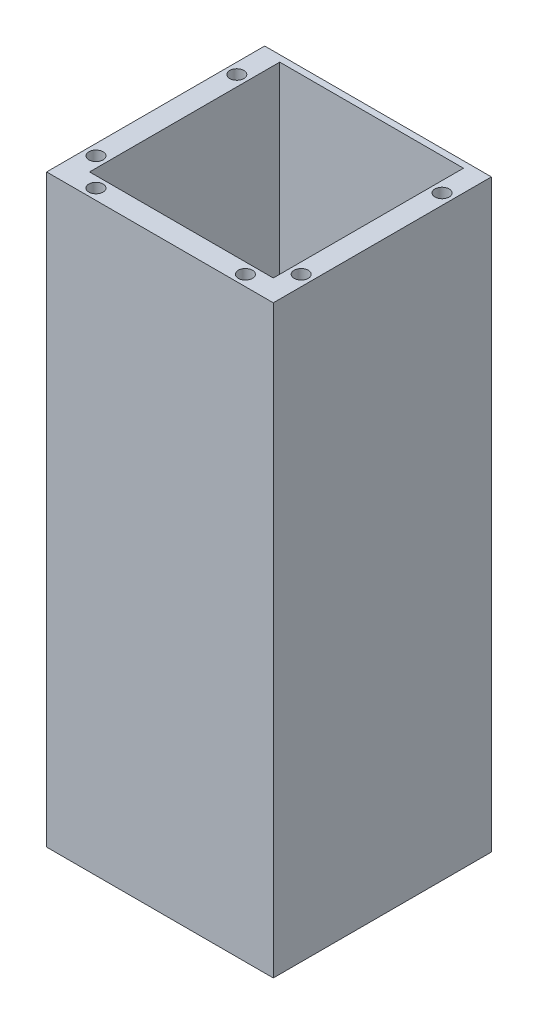
ISO-10303-21;
HEADER;
FILE_DESCRIPTION(('STEP AP214'),'2;1');
FILE_NAME('part.step','',(''),(''),'','','');
FILE_SCHEMA(('AUTOMOTIVE_DESIGN { 1 0 10303 214 1 1 1 1 }'));
ENDSEC;
DATA;
#1=APPLICATION_CONTEXT('core data for automotive mechanical design processes');
#2=APPLICATION_PROTOCOL_DEFINITION('international standard','automotive_design',2000,#1);
#3=PRODUCT_CONTEXT('',#1,'mechanical');
#4=PRODUCT('Part','Part','',(#3));
#5=PRODUCT_RELATED_PRODUCT_CATEGORY('part','',(#4));
#6=PRODUCT_DEFINITION_FORMATION('','',#4);
#7=PRODUCT_DEFINITION_CONTEXT('part definition',#1,'design');
#8=PRODUCT_DEFINITION('design','',#6,#7);
#9=PRODUCT_DEFINITION_SHAPE('','',#8);
#10=(LENGTH_UNIT() NAMED_UNIT(*) SI_UNIT(.MILLI.,.METRE.));
#11=(NAMED_UNIT(*) PLANE_ANGLE_UNIT() SI_UNIT($,.RADIAN.));
#12=(NAMED_UNIT(*) SI_UNIT($,.STERADIAN.) SOLID_ANGLE_UNIT());
#13=UNCERTAINTY_MEASURE_WITH_UNIT(LENGTH_MEASURE(1.E-05),#10,'distance_accuracy_value','');
#14=(GEOMETRIC_REPRESENTATION_CONTEXT(3) GLOBAL_UNCERTAINTY_ASSIGNED_CONTEXT((#13)) GLOBAL_UNIT_ASSIGNED_CONTEXT((#10,
#11,#12)) REPRESENTATION_CONTEXT('',''));
#15=CARTESIAN_POINT('',(0.,0.,0.));
#16=DIRECTION('',(0.,0.,1.));
#17=DIRECTION('',(1.,0.,0.));
#18=AXIS2_PLACEMENT_3D('',#15,#16,#17);
#19=CARTESIAN_POINT('',(-57.9891737439479,54.9791860465116,101.6));
#20=DIRECTION('',(1.,0.,0.));
#21=DIRECTION('',(0.,1.,0.));
#22=AXIS2_PLACEMENT_3D('',#19,#20,#21);
#23=PLANE('',#22);
#24=DIRECTION('',(0.,-1.,0.));
#25=VECTOR('',#24,1.);
#26=CARTESIAN_POINT('',(-57.9891737439479,54.9791860465116,0.));
#27=LINE('',#26,#25);
#28=CARTESIAN_POINT('',(-57.9891737439479,54.9791860465116,0.));
#29=VERTEX_POINT('',#28);
#30=CARTESIAN_POINT('',(-57.9891737439479,-217.420813953488,0.));
#31=VERTEX_POINT('',#30);
#32=EDGE_CURVE('E234',#29,#31,#27,.T.);
#33=ORIENTED_EDGE('',*,*,#32,.T.);
#34=DIRECTION('',(0.,0.,-1.));
#35=VECTOR('',#34,1.);
#36=CARTESIAN_POINT('',(-57.9891737439479,-217.420813953488,101.6));
#37=LINE('',#36,#35);
#38=CARTESIAN_POINT('',(-57.9891737439479,-217.420813953488,101.6));
#39=VERTEX_POINT('',#38);
#40=EDGE_CURVE('E40',#39,#31,#37,.T.);
#41=ORIENTED_EDGE('',*,*,#40,.F.);
#42=DIRECTION('',(0.,-1.,0.));
#43=VECTOR('',#42,1.);
#44=CARTESIAN_POINT('',(-57.9891737439479,54.9791860465116,101.6));
#45=LINE('',#44,#43);
#46=CARTESIAN_POINT('',(-57.9891737439479,54.9791860465116,101.6));
#47=VERTEX_POINT('',#46);
#48=EDGE_CURVE('E240',#47,#39,#45,.T.);
#49=ORIENTED_EDGE('',*,*,#48,.F.);
#50=DIRECTION('',(0.,0.,-1.));
#51=VECTOR('',#50,1.);
#52=CARTESIAN_POINT('',(-57.9891737439479,54.9791860465116,101.6));
#53=LINE('',#52,#51);
#54=EDGE_CURVE('E250',#47,#29,#53,.T.);
#55=ORIENTED_EDGE('',*,*,#54,.T.);
#56=EDGE_LOOP('',(#33,#41,#49,#55));
#57=FACE_BOUND('',#56,.T.);
#58=ADVANCED_FACE('F33',(#57),#23,.F.);
#59=CARTESIAN_POINT('',(-57.9891737439479,-217.420813953488,101.6));
#60=DIRECTION('',(0.,1.,0.));
#61=DIRECTION('',(0.,0.,1.));
#62=AXIS2_PLACEMENT_3D('',#59,#60,#61);
#63=PLANE('',#62);
#64=DIRECTION('',(1.,0.,0.));
#65=VECTOR('',#64,1.);
#66=CARTESIAN_POINT('',(-47.9891737439479,-217.420813953488,71.6));
#67=LINE('',#66,#65);
#68=CARTESIAN_POINT('',(-47.9891737439479,-217.420813953488,71.6));
#69=VERTEX_POINT('',#68);
#70=CARTESIAN_POINT('',(37.6108262560521,-217.420813953488,71.6));
#71=VERTEX_POINT('',#70);
#72=EDGE_CURVE('E203',#69,#71,#67,.T.);
#73=ORIENTED_EDGE('',*,*,#72,.F.);
#74=DIRECTION('',(0.,0.,-1.));
#75=VECTOR('',#74,1.);
#76=CARTESIAN_POINT('',(-47.9891737439479,-217.420813953488,91.6));
#77=LINE('',#76,#75);
#78=CARTESIAN_POINT('',(-47.9891737439479,-217.420813953488,91.6));
#79=VERTEX_POINT('',#78);
#80=EDGE_CURVE('E55',#79,#69,#77,.T.);
#81=ORIENTED_EDGE('',*,*,#80,.F.);
#82=DIRECTION('',(-1.,0.,0.));
#83=VECTOR('',#82,1.);
#84=CARTESIAN_POINT('',(-47.9891737439479,-217.420813953488,91.6));
#85=LINE('',#84,#83);
#86=CARTESIAN_POINT('',(37.6108262560521,-217.420813953488,91.6));
#87=VERTEX_POINT('',#86);
#88=EDGE_CURVE('E209',#87,#79,#85,.T.);
#89=ORIENTED_EDGE('',*,*,#88,.F.);
#90=DIRECTION('',(0.,0.,1.));
#91=VECTOR('',#90,1.);
#92=CARTESIAN_POINT('',(37.6108262560521,-217.420813953488,91.6));
#93=LINE('',#92,#91);
#94=EDGE_CURVE('E206',#71,#87,#93,.T.);
#95=ORIENTED_EDGE('',*,*,#94,.F.);
#96=EDGE_LOOP('',(#73,#81,#89,#95));
#97=FACE_BOUND('',#96,.T.);
#98=DIRECTION('',(1.,0.,0.));
#99=VECTOR('',#98,1.);
#100=CARTESIAN_POINT('',(-57.9891737439479,-217.420813953488,0.));
#101=LINE('',#100,#99);
#102=CARTESIAN_POINT('',(47.6108262560521,-217.420813953488,0.));
#103=VERTEX_POINT('',#102);
#104=EDGE_CURVE('E253',#31,#103,#101,.T.);
#105=ORIENTED_EDGE('',*,*,#104,.T.);
#106=DIRECTION('',(0.,0.,-1.));
#107=VECTOR('',#106,1.);
#108=CARTESIAN_POINT('',(47.6108262560521,-217.420813953488,101.6));
#109=LINE('',#108,#107);
#110=CARTESIAN_POINT('',(47.6108262560521,-217.420813953488,101.6));
#111=VERTEX_POINT('',#110);
#112=EDGE_CURVE('E263',#111,#103,#109,.T.);
#113=ORIENTED_EDGE('',*,*,#112,.F.);
#114=DIRECTION('',(1.,0.,0.));
#115=VECTOR('',#114,1.);
#116=CARTESIAN_POINT('',(-57.9891737439479,-217.420813953488,101.6));
#117=LINE('',#116,#115);
#118=EDGE_CURVE('E243',#39,#111,#117,.T.);
#119=ORIENTED_EDGE('',*,*,#118,.F.);
#120=ORIENTED_EDGE('',*,*,#40,.T.);
#121=EDGE_LOOP('',(#105,#113,#119,#120));
#122=FACE_BOUND('',#121,.T.);
#123=ADVANCED_FACE('F268',(#97,#122),#63,.F.);
#124=CARTESIAN_POINT('',(47.6108262560521,54.9791860465116,101.6));
#125=DIRECTION('',(-1.,0.,0.));
#126=DIRECTION('',(0.,-1.,0.));
#127=AXIS2_PLACEMENT_3D('',#124,#125,#126);
#128=PLANE('',#127);
#129=DIRECTION('',(0.,1.,0.));
#130=VECTOR('',#129,1.);
#131=CARTESIAN_POINT('',(47.6108262560521,54.9791860465116,0.));
#132=LINE('',#131,#130);
#133=CARTESIAN_POINT('',(47.6108262560521,54.9791860465116,0.));
#134=VERTEX_POINT('',#133);
#135=EDGE_CURVE('E255',#103,#134,#132,.T.);
#136=ORIENTED_EDGE('',*,*,#135,.T.);
#137=DIRECTION('',(0.,0.,-1.));
#138=VECTOR('',#137,1.);
#139=CARTESIAN_POINT('',(47.6108262560521,54.9791860465116,101.6));
#140=LINE('',#139,#138);
#141=CARTESIAN_POINT('',(47.6108262560521,54.9791860465116,101.6));
#142=VERTEX_POINT('',#141);
#143=EDGE_CURVE('E260',#142,#134,#140,.T.);
#144=ORIENTED_EDGE('',*,*,#143,.F.);
#145=DIRECTION('',(0.,1.,0.));
#146=VECTOR('',#145,1.);
#147=CARTESIAN_POINT('',(47.6108262560521,54.9791860465116,101.6));
#148=LINE('',#147,#146);
#149=EDGE_CURVE('E246',#111,#142,#148,.T.);
#150=ORIENTED_EDGE('',*,*,#149,.F.);
#151=ORIENTED_EDGE('',*,*,#112,.T.);
#152=EDGE_LOOP('',(#136,#144,#150,#151));
#153=FACE_BOUND('',#152,.T.);
#154=ADVANCED_FACE('F280',(#153),#128,.F.);
#155=CARTESIAN_POINT('',(-57.9891737439479,54.9791860465116,101.6));
#156=DIRECTION('',(0.,-1.,0.));
#157=DIRECTION('',(0.,0.,-1.));
#158=AXIS2_PLACEMENT_3D('',#155,#156,#157);
#159=PLANE('',#158);
#160=CARTESIAN_POINT('',(-52.9891737439479,54.9791860465116,18.));
#161=DIRECTION('',(0.,1.,0.));
#162=DIRECTION('',(0.,0.,1.));
#163=AXIS2_PLACEMENT_3D('',#160,#161,#162);
#164=CIRCLE('',#163,3.3);
#165=CARTESIAN_POINT('',(-52.9891737439479,54.9791860465116,21.3));
#166=VERTEX_POINT('',#165);
#167=EDGE_CURVE('E151',#166,#166,#164,.T.);
#168=ORIENTED_EDGE('',*,*,#167,.F.);
#169=EDGE_LOOP('',(#168));
#170=FACE_BOUND('',#169,.T.);
#171=CARTESIAN_POINT('',(-52.9891737439479,54.9791860465116,83.6));
#172=DIRECTION('',(0.,1.,0.));
#173=DIRECTION('',(0.,0.,1.));
#174=AXIS2_PLACEMENT_3D('',#171,#172,#173);
#175=CIRCLE('',#174,3.3);
#176=CARTESIAN_POINT('',(-52.9891737439479,54.9791860465116,86.9));
#177=VERTEX_POINT('',#176);
#178=EDGE_CURVE('E150',#177,#177,#175,.T.);
#179=ORIENTED_EDGE('',*,*,#178,.F.);
#180=EDGE_LOOP('',(#179));
#181=FACE_BOUND('',#180,.T.);
#182=CARTESIAN_POINT('',(42.6108262560521,54.9791860465116,18.));
#183=DIRECTION('',(0.,1.,0.));
#184=DIRECTION('',(0.,0.,1.));
#185=AXIS2_PLACEMENT_3D('',#182,#183,#184);
#186=CIRCLE('',#185,3.3);
#187=CARTESIAN_POINT('',(42.6108262560521,54.9791860465116,21.3));
#188=VERTEX_POINT('',#187);
#189=EDGE_CURVE('E161',#188,#188,#186,.T.);
#190=ORIENTED_EDGE('',*,*,#189,.F.);
#191=EDGE_LOOP('',(#190));
#192=FACE_BOUND('',#191,.T.);
#193=CARTESIAN_POINT('',(42.6108262560521,54.9791860465116,83.6));
#194=DIRECTION('',(0.,1.,0.));
#195=DIRECTION('',(0.,0.,1.));
#196=AXIS2_PLACEMENT_3D('',#193,#194,#195);
#197=CIRCLE('',#196,3.3);
#198=CARTESIAN_POINT('',(42.6108262560521,54.9791860465116,86.9));
#199=VERTEX_POINT('',#198);
#200=EDGE_CURVE('E167',#199,#199,#197,.T.);
#201=ORIENTED_EDGE('',*,*,#200,.F.);
#202=EDGE_LOOP('',(#201));
#203=FACE_BOUND('',#202,.T.);
#204=CARTESIAN_POINT('',(-39.9891737439479,54.9791860465116,96.6));
#205=DIRECTION('',(0.,1.,0.));
#206=DIRECTION('',(0.,0.,1.));
#207=AXIS2_PLACEMENT_3D('',#204,#205,#206);
#208=CIRCLE('',#207,3.3);
#209=CARTESIAN_POINT('',(-39.9891737439479,54.9791860465116,99.9));
#210=VERTEX_POINT('',#209);
#211=EDGE_CURVE('E173',#210,#210,#208,.T.);
#212=ORIENTED_EDGE('',*,*,#211,.F.);
#213=EDGE_LOOP('',(#212));
#214=FACE_BOUND('',#213,.T.);
#215=CARTESIAN_POINT('',(29.6108262560521,54.9791860465116,96.6));
#216=DIRECTION('',(0.,1.,0.));
#217=DIRECTION('',(0.,0.,1.));
#218=AXIS2_PLACEMENT_3D('',#215,#216,#217);
#219=CIRCLE('',#218,3.3);
#220=CARTESIAN_POINT('',(29.6108262560521,54.9791860465116,99.9));
#221=VERTEX_POINT('',#220);
#222=EDGE_CURVE('E179',#221,#221,#219,.T.);
#223=ORIENTED_EDGE('',*,*,#222,.F.);
#224=EDGE_LOOP('',(#223));
#225=FACE_BOUND('',#224,.T.);
#226=DIRECTION('',(1.,0.,0.));
#227=VECTOR('',#226,1.);
#228=CARTESIAN_POINT('',(-47.9891737439479,54.9791860465116,91.6));
#229=LINE('',#228,#227);
#230=CARTESIAN_POINT('',(-47.9891737439479,54.9791860465116,91.6));
#231=VERTEX_POINT('',#230);
#232=CARTESIAN_POINT('',(37.6108262560521,54.9791860465116,91.6));
#233=VERTEX_POINT('',#232);
#234=EDGE_CURVE('E224',#231,#233,#229,.T.);
#235=ORIENTED_EDGE('',*,*,#234,.F.);
#236=DIRECTION('',(0.,0.,1.));
#237=VECTOR('',#236,1.);
#238=CARTESIAN_POINT('',(-47.9891737439479,54.9791860465116,3.));
#239=LINE('',#238,#237);
#240=CARTESIAN_POINT('',(-47.9891737439479,54.9791860465116,3.));
#241=VERTEX_POINT('',#240);
#242=EDGE_CURVE('E215',#241,#231,#239,.T.);
#243=ORIENTED_EDGE('',*,*,#242,.F.);
#244=DIRECTION('',(-1.,0.,0.));
#245=VECTOR('',#244,1.);
#246=CARTESIAN_POINT('',(-47.9891737439479,54.9791860465116,3.));
#247=LINE('',#246,#245);
#248=CARTESIAN_POINT('',(37.6108262560521,54.9791860465116,3.));
#249=VERTEX_POINT('',#248);
#250=EDGE_CURVE('E219',#249,#241,#247,.T.);
#251=ORIENTED_EDGE('',*,*,#250,.F.);
#252=DIRECTION('',(0.,0.,-1.));
#253=VECTOR('',#252,1.);
#254=CARTESIAN_POINT('',(37.6108262560521,54.9791860465116,3.));
#255=LINE('',#254,#253);
#256=EDGE_CURVE('E227',#233,#249,#255,.T.);
#257=ORIENTED_EDGE('',*,*,#256,.F.);
#258=EDGE_LOOP('',(#235,#243,#251,#257));
#259=FACE_BOUND('',#258,.T.);
#260=DIRECTION('',(-1.,0.,0.));
#261=VECTOR('',#260,1.);
#262=CARTESIAN_POINT('',(-57.9891737439479,54.9791860465116,0.));
#263=LINE('',#262,#261);
#264=EDGE_CURVE('E244',#134,#29,#263,.T.);
#265=ORIENTED_EDGE('',*,*,#264,.T.);
#266=ORIENTED_EDGE('',*,*,#54,.F.);
#267=DIRECTION('',(-1.,0.,0.));
#268=VECTOR('',#267,1.);
#269=CARTESIAN_POINT('',(-57.9891737439479,54.9791860465116,101.6));
#270=LINE('',#269,#268);
#271=EDGE_CURVE('E248',#142,#47,#270,.T.);
#272=ORIENTED_EDGE('',*,*,#271,.F.);
#273=ORIENTED_EDGE('',*,*,#143,.T.);
#274=EDGE_LOOP('',(#265,#266,#272,#273));
#275=FACE_BOUND('',#274,.T.);
#276=ADVANCED_FACE('F284',(#170,#181,#192,#203,#214,#225,#259,#275),#159,.F.);
#277=CARTESIAN_POINT('',(0.,0.,101.6));
#278=DIRECTION('',(0.,0.,1.));
#279=DIRECTION('',(1.,0.,0.));
#280=AXIS2_PLACEMENT_3D('',#277,#278,#279);
#281=PLANE('',#280);
#282=ORIENTED_EDGE('',*,*,#48,.T.);
#283=ORIENTED_EDGE('',*,*,#118,.T.);
#284=ORIENTED_EDGE('',*,*,#149,.T.);
#285=ORIENTED_EDGE('',*,*,#271,.T.);
#286=EDGE_LOOP('',(#282,#283,#284,#285));
#287=FACE_BOUND('',#286,.T.);
#288=ADVANCED_FACE('F286',(#287),#281,.T.);
#289=CARTESIAN_POINT('',(0.,0.,0.));
#290=DIRECTION('',(0.,0.,1.));
#291=DIRECTION('',(1.,0.,0.));
#292=AXIS2_PLACEMENT_3D('',#289,#290,#291);
#293=PLANE('',#292);
#294=DIRECTION('',(-1.,0.,0.));
#295=VECTOR('',#294,1.);
#296=CARTESIAN_POINT('',(37.6108262560521,-207.420813953488,0.));
#297=LINE('',#296,#295);
#298=CARTESIAN_POINT('',(37.6108262560521,-207.420813953488,0.));
#299=VERTEX_POINT('',#298);
#300=CARTESIAN_POINT('',(-47.9891737439479,-207.420813953488,0.));
#301=VERTEX_POINT('',#300);
#302=EDGE_CURVE('E187',#299,#301,#297,.T.);
#303=ORIENTED_EDGE('',*,*,#302,.F.);
#304=DIRECTION('',(0.,-1.,0.));
#305=VECTOR('',#304,1.);
#306=CARTESIAN_POINT('',(37.6108262560521,-141.820813953488,0.));
#307=LINE('',#306,#305);
#308=CARTESIAN_POINT('',(37.6108262560521,-141.820813953488,0.));
#309=VERTEX_POINT('',#308);
#310=EDGE_CURVE('E185',#309,#299,#307,.T.);
#311=ORIENTED_EDGE('',*,*,#310,.F.);
#312=DIRECTION('',(1.,0.,0.));
#313=VECTOR('',#312,1.);
#314=CARTESIAN_POINT('',(37.6108262560521,-141.820813953488,0.));
#315=LINE('',#314,#313);
#316=CARTESIAN_POINT('',(-47.9891737439479,-141.820813953488,0.));
#317=VERTEX_POINT('',#316);
#318=EDGE_CURVE('E192',#317,#309,#315,.T.);
#319=ORIENTED_EDGE('',*,*,#318,.F.);
#320=DIRECTION('',(0.,1.,0.));
#321=VECTOR('',#320,1.);
#322=CARTESIAN_POINT('',(-47.9891737439479,-141.820813953488,0.));
#323=LINE('',#322,#321);
#324=EDGE_CURVE('E189',#301,#317,#323,.T.);
#325=ORIENTED_EDGE('',*,*,#324,.F.);
#326=EDGE_LOOP('',(#303,#311,#319,#325));
#327=FACE_BOUND('',#326,.T.);
#328=ORIENTED_EDGE('',*,*,#32,.F.);
#329=ORIENTED_EDGE('',*,*,#264,.F.);
#330=ORIENTED_EDGE('',*,*,#135,.F.);
#331=ORIENTED_EDGE('',*,*,#104,.F.);
#332=EDGE_LOOP('',(#328,#329,#330,#331));
#333=FACE_BOUND('',#332,.T.);
#334=ADVANCED_FACE('F276',(#327,#333),#293,.F.);
#335=CARTESIAN_POINT('',(-47.9891737439479,-207.420813953488,3.));
#336=DIRECTION('',(-1.,0.,0.));
#337=DIRECTION('',(0.,0.,1.));
#338=AXIS2_PLACEMENT_3D('',#335,#336,#337);
#339=PLANE('',#338);
#340=DIRECTION('',(0.,0.,-1.));
#341=VECTOR('',#340,1.);
#342=CARTESIAN_POINT('',(-47.9891737439479,-141.820813953488,30.));
#343=LINE('',#342,#341);
#344=CARTESIAN_POINT('',(-47.9891737439479,-141.820813953488,3.));
#345=VERTEX_POINT('',#344);
#346=EDGE_CURVE('E195',#345,#317,#343,.T.);
#347=ORIENTED_EDGE('',*,*,#346,.F.);
#348=DIRECTION('',(0.,1.,0.));
#349=VECTOR('',#348,1.);
#350=CARTESIAN_POINT('',(-47.9891737439479,-207.420813953488,3.));
#351=LINE('',#350,#349);
#352=EDGE_CURVE('E232',#345,#241,#351,.T.);
#353=ORIENTED_EDGE('',*,*,#352,.T.);
#354=ORIENTED_EDGE('',*,*,#242,.T.);
#355=DIRECTION('',(0.,1.,0.));
#356=VECTOR('',#355,1.);
#357=CARTESIAN_POINT('',(-47.9891737439479,-207.420813953488,91.6));
#358=LINE('',#357,#356);
#359=EDGE_CURVE('E221',#79,#231,#358,.T.);
#360=ORIENTED_EDGE('',*,*,#359,.F.);
#361=ORIENTED_EDGE('',*,*,#80,.T.);
#362=DIRECTION('',(0.,-1.,0.));
#363=VECTOR('',#362,1.);
#364=CARTESIAN_POINT('',(-47.9891737439479,-187.420813953488,71.6));
#365=LINE('',#364,#363);
#366=CARTESIAN_POINT('',(-47.9891737439479,-207.420813953488,71.6));
#367=VERTEX_POINT('',#366);
#368=EDGE_CURVE('E212',#367,#69,#365,.T.);
#369=ORIENTED_EDGE('',*,*,#368,.F.);
#370=DIRECTION('',(0.,0.,1.));
#371=VECTOR('',#370,1.);
#372=CARTESIAN_POINT('',(-47.9891737439479,-207.420813953488,3.));
#373=LINE('',#372,#371);
#374=EDGE_CURVE('E217',#301,#367,#373,.T.);
#375=ORIENTED_EDGE('',*,*,#374,.F.);
#376=ORIENTED_EDGE('',*,*,#324,.T.);
#377=EDGE_LOOP('',(#347,#353,#354,#360,#361,#369,#375,#376));
#378=FACE_BOUND('',#377,.T.);
#379=ADVANCED_FACE('F293',(#378),#339,.F.);
#380=CARTESIAN_POINT('',(-47.9891737439479,-207.420813953488,3.));
#381=DIRECTION('',(0.,0.,-1.));
#382=DIRECTION('',(-1.,0.,0.));
#383=AXIS2_PLACEMENT_3D('',#380,#381,#382);
#384=PLANE('',#383);
#385=ORIENTED_EDGE('',*,*,#352,.F.);
#386=DIRECTION('',(1.,0.,0.));
#387=VECTOR('',#386,1.);
#388=CARTESIAN_POINT('',(-47.9891737439479,-141.820813953488,3.));
#389=LINE('',#388,#387);
#390=CARTESIAN_POINT('',(37.6108262560521,-141.820813953488,3.));
#391=VERTEX_POINT('',#390);
#392=EDGE_CURVE('E198',#345,#391,#389,.T.);
#393=ORIENTED_EDGE('',*,*,#392,.T.);
#394=DIRECTION('',(0.,1.,0.));
#395=VECTOR('',#394,1.);
#396=CARTESIAN_POINT('',(37.6108262560521,-207.420813953488,3.));
#397=LINE('',#396,#395);
#398=EDGE_CURVE('E235',#391,#249,#397,.T.);
#399=ORIENTED_EDGE('',*,*,#398,.T.);
#400=ORIENTED_EDGE('',*,*,#250,.T.);
#401=EDGE_LOOP('',(#385,#393,#399,#400));
#402=FACE_BOUND('',#401,.T.);
#403=ADVANCED_FACE('F323',(#402),#384,.F.);
#404=CARTESIAN_POINT('',(37.6108262560521,-207.420813953488,3.));
#405=DIRECTION('',(1.,0.,0.));
#406=DIRECTION('',(0.,0.,-1.));
#407=AXIS2_PLACEMENT_3D('',#404,#405,#406);
#408=PLANE('',#407);
#409=ORIENTED_EDGE('',*,*,#398,.F.);
#410=DIRECTION('',(0.,0.,-1.));
#411=VECTOR('',#410,1.);
#412=CARTESIAN_POINT('',(37.6108262560521,-141.820813953488,30.));
#413=LINE('',#412,#411);
#414=EDGE_CURVE('E196',#391,#309,#413,.T.);
#415=ORIENTED_EDGE('',*,*,#414,.T.);
#416=ORIENTED_EDGE('',*,*,#310,.T.);
#417=DIRECTION('',(0.,0.,-1.));
#418=VECTOR('',#417,1.);
#419=CARTESIAN_POINT('',(37.6108262560521,-207.420813953488,3.));
#420=LINE('',#419,#418);
#421=CARTESIAN_POINT('',(37.6108262560521,-207.420813953488,71.6));
#422=VERTEX_POINT('',#421);
#423=EDGE_CURVE('E47',#422,#299,#420,.T.);
#424=ORIENTED_EDGE('',*,*,#423,.F.);
#425=DIRECTION('',(0.,-1.,0.));
#426=VECTOR('',#425,1.);
#427=CARTESIAN_POINT('',(37.6108262560521,-187.420813953488,71.6));
#428=LINE('',#427,#426);
#429=EDGE_CURVE('E213',#422,#71,#428,.T.);
#430=ORIENTED_EDGE('',*,*,#429,.T.);
#431=ORIENTED_EDGE('',*,*,#94,.T.);
#432=DIRECTION('',(0.,1.,0.));
#433=VECTOR('',#432,1.);
#434=CARTESIAN_POINT('',(37.6108262560521,-207.420813953488,91.6));
#435=LINE('',#434,#433);
#436=EDGE_CURVE('E237',#87,#233,#435,.T.);
#437=ORIENTED_EDGE('',*,*,#436,.T.);
#438=ORIENTED_EDGE('',*,*,#256,.T.);
#439=EDGE_LOOP('',(#409,#415,#416,#424,#430,#431,#437,#438));
#440=FACE_BOUND('',#439,.T.);
#441=ADVANCED_FACE('F333',(#440),#408,.F.);
#442=CARTESIAN_POINT('',(-47.9891737439479,-207.420813953488,91.6));
#443=DIRECTION('',(0.,0.,1.));
#444=DIRECTION('',(1.,0.,0.));
#445=AXIS2_PLACEMENT_3D('',#442,#443,#444);
#446=PLANE('',#445);
#447=ORIENTED_EDGE('',*,*,#359,.T.);
#448=ORIENTED_EDGE('',*,*,#234,.T.);
#449=ORIENTED_EDGE('',*,*,#436,.F.);
#450=ORIENTED_EDGE('',*,*,#88,.T.);
#451=EDGE_LOOP('',(#447,#448,#449,#450));
#452=FACE_BOUND('',#451,.T.);
#453=ADVANCED_FACE('F331',(#452),#446,.F.);
#454=CARTESIAN_POINT('',(0.,-207.420813953488,0.));
#455=DIRECTION('',(0.,1.,0.));
#456=DIRECTION('',(0.,0.,1.));
#457=AXIS2_PLACEMENT_3D('',#454,#455,#456);
#458=PLANE('',#457);
#459=ORIENTED_EDGE('',*,*,#374,.T.);
#460=DIRECTION('',(-1.,0.,0.));
#461=VECTOR('',#460,1.);
#462=CARTESIAN_POINT('',(0.,-207.420813953488,71.6));
#463=LINE('',#462,#461);
#464=EDGE_CURVE('E11',#422,#367,#463,.T.);
#465=ORIENTED_EDGE('',*,*,#464,.F.);
#466=ORIENTED_EDGE('',*,*,#423,.T.);
#467=ORIENTED_EDGE('',*,*,#302,.T.);
#468=EDGE_LOOP('',(#459,#465,#466,#467));
#469=FACE_BOUND('',#468,.T.);
#470=ADVANCED_FACE('F317',(#469),#458,.T.);
#471=CARTESIAN_POINT('',(-47.9891737439479,-187.420813953488,71.6));
#472=DIRECTION('',(0.,0.,-1.));
#473=DIRECTION('',(-1.,0.,0.));
#474=AXIS2_PLACEMENT_3D('',#471,#472,#473);
#475=PLANE('',#474);
#476=ORIENTED_EDGE('',*,*,#464,.T.);
#477=ORIENTED_EDGE('',*,*,#368,.T.);
#478=ORIENTED_EDGE('',*,*,#72,.T.);
#479=ORIENTED_EDGE('',*,*,#429,.F.);
#480=EDGE_LOOP('',(#476,#477,#478,#479));
#481=FACE_BOUND('',#480,.T.);
#482=ADVANCED_FACE('F312',(#481),#475,.F.);
#483=CARTESIAN_POINT('',(37.6108262560521,-141.820813953488,30.));
#484=DIRECTION('',(0.,1.,0.));
#485=DIRECTION('',(0.,0.,1.));
#486=AXIS2_PLACEMENT_3D('',#483,#484,#485);
#487=PLANE('',#486);
#488=ORIENTED_EDGE('',*,*,#346,.T.);
#489=ORIENTED_EDGE('',*,*,#318,.T.);
#490=ORIENTED_EDGE('',*,*,#414,.F.);
#491=ORIENTED_EDGE('',*,*,#392,.F.);
#492=EDGE_LOOP('',(#488,#489,#490,#491));
#493=FACE_BOUND('',#492,.T.);
#494=ADVANCED_FACE('F320',(#493),#487,.F.);
#495=CARTESIAN_POINT('',(29.6108262560521,44.9791860465116,96.6));
#496=DIRECTION('',(0.,1.,0.));
#497=DIRECTION('',(0.,0.,1.));
#498=AXIS2_PLACEMENT_3D('',#495,#496,#497);
#499=CONICAL_SURFACE('',#498,3.3,1.02974425867665);
#500=CARTESIAN_POINT('',(29.610826256052,42.9963460037207,96.6));
#501=VERTEX_POINT('',#500);
#502=VERTEX_LOOP('',#501);
#503=FACE_BOUND('',#502,.T.);
#504=CARTESIAN_POINT('',(29.6108262560521,44.9791860465116,96.6));
#505=DIRECTION('',(0.,1.,0.));
#506=DIRECTION('',(0.,0.,1.));
#507=AXIS2_PLACEMENT_3D('',#504,#505,#506);
#508=CIRCLE('',#507,3.3);
#509=CARTESIAN_POINT('',(29.6108262560521,44.9791860465116,99.9));
#510=VERTEX_POINT('',#509);
#511=EDGE_CURVE('E182',#510,#510,#508,.T.);
#512=ORIENTED_EDGE('',*,*,#511,.T.);
#513=EDGE_LOOP('',(#512));
#514=FACE_BOUND('',#513,.T.);
#515=ADVANCED_FACE('F377',(#503,#514),#499,.F.);
#516=CARTESIAN_POINT('',(29.6108262560521,54.9791860465116,96.6));
#517=DIRECTION('',(0.,1.,0.));
#518=DIRECTION('',(0.,0.,1.));
#519=AXIS2_PLACEMENT_3D('',#516,#517,#518);
#520=CYLINDRICAL_SURFACE('',#519,3.3);
#521=ORIENTED_EDGE('',*,*,#511,.F.);
#522=EDGE_LOOP('',(#521));
#523=FACE_BOUND('',#522,.T.);
#524=ORIENTED_EDGE('',*,*,#222,.T.);
#525=EDGE_LOOP('',(#524));
#526=FACE_BOUND('',#525,.T.);
#527=ADVANCED_FACE('F394',(#523,#526),#520,.F.);
#528=CARTESIAN_POINT('',(-39.9891737439479,44.9791860465116,96.6));
#529=DIRECTION('',(0.,1.,0.));
#530=DIRECTION('',(0.,0.,1.));
#531=AXIS2_PLACEMENT_3D('',#528,#529,#530);
#532=CONICAL_SURFACE('',#531,3.3,1.02974425867665);
#533=CARTESIAN_POINT('',(-39.9891737439479,42.9963460037207,96.6));
#534=VERTEX_POINT('',#533);
#535=VERTEX_LOOP('',#534);
#536=FACE_BOUND('',#535,.T.);
#537=CARTESIAN_POINT('',(-39.9891737439479,44.9791860465116,96.6));
#538=DIRECTION('',(0.,1.,0.));
#539=DIRECTION('',(0.,0.,1.));
#540=AXIS2_PLACEMENT_3D('',#537,#538,#539);
#541=CIRCLE('',#540,3.3);
#542=CARTESIAN_POINT('',(-39.9891737439479,44.9791860465116,99.9));
#543=VERTEX_POINT('',#542);
#544=EDGE_CURVE('E176',#543,#543,#541,.T.);
#545=ORIENTED_EDGE('',*,*,#544,.T.);
#546=EDGE_LOOP('',(#545));
#547=FACE_BOUND('',#546,.T.);
#548=ADVANCED_FACE('F404',(#536,#547),#532,.F.);
#549=CARTESIAN_POINT('',(-39.9891737439479,54.9791860465116,96.6));
#550=DIRECTION('',(0.,1.,0.));
#551=DIRECTION('',(0.,0.,1.));
#552=AXIS2_PLACEMENT_3D('',#549,#550,#551);
#553=CYLINDRICAL_SURFACE('',#552,3.3);
#554=ORIENTED_EDGE('',*,*,#544,.F.);
#555=EDGE_LOOP('',(#554));
#556=FACE_BOUND('',#555,.T.);
#557=ORIENTED_EDGE('',*,*,#211,.T.);
#558=EDGE_LOOP('',(#557));
#559=FACE_BOUND('',#558,.T.);
#560=ADVANCED_FACE('F414',(#556,#559),#553,.F.);
#561=CARTESIAN_POINT('',(42.6108262560521,44.9791860465116,83.6));
#562=DIRECTION('',(0.,1.,0.));
#563=DIRECTION('',(0.,0.,1.));
#564=AXIS2_PLACEMENT_3D('',#561,#562,#563);
#565=CONICAL_SURFACE('',#564,3.3,1.02974425867665);
#566=CARTESIAN_POINT('',(42.6108262560521,42.9963460037207,83.6));
#567=VERTEX_POINT('',#566);
#568=VERTEX_LOOP('',#567);
#569=FACE_BOUND('',#568,.T.);
#570=CARTESIAN_POINT('',(42.6108262560521,44.9791860465116,83.6));
#571=DIRECTION('',(0.,1.,0.));
#572=DIRECTION('',(0.,0.,1.));
#573=AXIS2_PLACEMENT_3D('',#570,#571,#572);
#574=CIRCLE('',#573,3.3);
#575=CARTESIAN_POINT('',(42.6108262560521,44.9791860465116,86.9));
#576=VERTEX_POINT('',#575);
#577=EDGE_CURVE('E170',#576,#576,#574,.T.);
#578=ORIENTED_EDGE('',*,*,#577,.T.);
#579=EDGE_LOOP('',(#578));
#580=FACE_BOUND('',#579,.T.);
#581=ADVANCED_FACE('F424',(#569,#580),#565,.F.);
#582=CARTESIAN_POINT('',(42.6108262560521,54.9791860465116,83.6));
#583=DIRECTION('',(0.,1.,0.));
#584=DIRECTION('',(0.,0.,1.));
#585=AXIS2_PLACEMENT_3D('',#582,#583,#584);
#586=CYLINDRICAL_SURFACE('',#585,3.3);
#587=ORIENTED_EDGE('',*,*,#577,.F.);
#588=EDGE_LOOP('',(#587));
#589=FACE_BOUND('',#588,.T.);
#590=ORIENTED_EDGE('',*,*,#200,.T.);
#591=EDGE_LOOP('',(#590));
#592=FACE_BOUND('',#591,.T.);
#593=ADVANCED_FACE('F434',(#589,#592),#586,.F.);
#594=CARTESIAN_POINT('',(42.6108262560521,44.9791860465116,18.));
#595=DIRECTION('',(0.,1.,0.));
#596=DIRECTION('',(0.,0.,1.));
#597=AXIS2_PLACEMENT_3D('',#594,#595,#596);
#598=CONICAL_SURFACE('',#597,3.3,1.02974425867665);
#599=CARTESIAN_POINT('',(42.6108262560521,42.9963460037207,18.));
#600=VERTEX_POINT('',#599);
#601=VERTEX_LOOP('',#600);
#602=FACE_BOUND('',#601,.T.);
#603=CARTESIAN_POINT('',(42.6108262560521,44.9791860465116,18.));
#604=DIRECTION('',(0.,1.,0.));
#605=DIRECTION('',(0.,0.,1.));
#606=AXIS2_PLACEMENT_3D('',#603,#604,#605);
#607=CIRCLE('',#606,3.3);
#608=CARTESIAN_POINT('',(42.6108262560521,44.9791860465116,21.3));
#609=VERTEX_POINT('',#608);
#610=EDGE_CURVE('E164',#609,#609,#607,.T.);
#611=ORIENTED_EDGE('',*,*,#610,.T.);
#612=EDGE_LOOP('',(#611));
#613=FACE_BOUND('',#612,.T.);
#614=ADVANCED_FACE('F444',(#602,#613),#598,.F.);
#615=CARTESIAN_POINT('',(42.6108262560521,54.9791860465116,18.));
#616=DIRECTION('',(0.,1.,0.));
#617=DIRECTION('',(0.,0.,1.));
#618=AXIS2_PLACEMENT_3D('',#615,#616,#617);
#619=CYLINDRICAL_SURFACE('',#618,3.3);
#620=ORIENTED_EDGE('',*,*,#610,.F.);
#621=EDGE_LOOP('',(#620));
#622=FACE_BOUND('',#621,.T.);
#623=ORIENTED_EDGE('',*,*,#189,.T.);
#624=EDGE_LOOP('',(#623));
#625=FACE_BOUND('',#624,.T.);
#626=ADVANCED_FACE('F454',(#622,#625),#619,.F.);
#627=CARTESIAN_POINT('',(-52.9891737439479,44.9791860465116,83.6));
#628=DIRECTION('',(0.,1.,0.));
#629=DIRECTION('',(0.,0.,1.));
#630=AXIS2_PLACEMENT_3D('',#627,#628,#629);
#631=CONICAL_SURFACE('',#630,3.3,1.02974425867665);
#632=CARTESIAN_POINT('',(-52.9891737439479,42.9963460037207,83.6));
#633=VERTEX_POINT('',#632);
#634=VERTEX_LOOP('',#633);
#635=FACE_BOUND('',#634,.T.);
#636=CARTESIAN_POINT('',(-52.9891737439479,44.9791860465116,83.6));
#637=DIRECTION('',(0.,1.,0.));
#638=DIRECTION('',(0.,0.,1.));
#639=AXIS2_PLACEMENT_3D('',#636,#637,#638);
#640=CIRCLE('',#639,3.3);
#641=CARTESIAN_POINT('',(-52.9891737439479,44.9791860465116,86.9));
#642=VERTEX_POINT('',#641);
#643=EDGE_CURVE('E154',#642,#642,#640,.T.);
#644=ORIENTED_EDGE('',*,*,#643,.T.);
#645=EDGE_LOOP('',(#644));
#646=FACE_BOUND('',#645,.T.);
#647=ADVANCED_FACE('F464',(#635,#646),#631,.F.);
#648=CARTESIAN_POINT('',(-52.9891737439479,54.9791860465116,83.6));
#649=DIRECTION('',(0.,1.,0.));
#650=DIRECTION('',(0.,0.,1.));
#651=AXIS2_PLACEMENT_3D('',#648,#649,#650);
#652=CYLINDRICAL_SURFACE('',#651,3.3);
#653=ORIENTED_EDGE('',*,*,#643,.F.);
#654=EDGE_LOOP('',(#653));
#655=FACE_BOUND('',#654,.T.);
#656=ORIENTED_EDGE('',*,*,#178,.T.);
#657=EDGE_LOOP('',(#656));
#658=FACE_BOUND('',#657,.T.);
#659=ADVANCED_FACE('F144',(#655,#658),#652,.F.);
#660=CARTESIAN_POINT('',(-52.9891737439479,44.9791860465116,18.));
#661=DIRECTION('',(0.,1.,0.));
#662=DIRECTION('',(0.,0.,1.));
#663=AXIS2_PLACEMENT_3D('',#660,#661,#662);
#664=CONICAL_SURFACE('',#663,3.3,1.02974425867665);
#665=CARTESIAN_POINT('',(-52.9891737439479,42.9963460037207,18.));
#666=VERTEX_POINT('',#665);
#667=VERTEX_LOOP('',#666);
#668=FACE_BOUND('',#667,.T.);
#669=CARTESIAN_POINT('',(-52.9891737439479,44.9791860465116,18.));
#670=DIRECTION('',(0.,1.,0.));
#671=DIRECTION('',(0.,0.,1.));
#672=AXIS2_PLACEMENT_3D('',#669,#670,#671);
#673=CIRCLE('',#672,3.3);
#674=CARTESIAN_POINT('',(-52.9891737439479,44.9791860465116,21.3));
#675=VERTEX_POINT('',#674);
#676=EDGE_CURVE('E148',#675,#675,#673,.T.);
#677=ORIENTED_EDGE('',*,*,#676,.T.);
#678=EDGE_LOOP('',(#677));
#679=FACE_BOUND('',#678,.T.);
#680=ADVANCED_FACE('F140',(#668,#679),#664,.F.);
#681=CARTESIAN_POINT('',(-52.9891737439479,54.9791860465116,18.));
#682=DIRECTION('',(0.,1.,0.));
#683=DIRECTION('',(0.,0.,1.));
#684=AXIS2_PLACEMENT_3D('',#681,#682,#683);
#685=CYLINDRICAL_SURFACE('',#684,3.3);
#686=ORIENTED_EDGE('',*,*,#676,.F.);
#687=EDGE_LOOP('',(#686));
#688=FACE_BOUND('',#687,.T.);
#689=ORIENTED_EDGE('',*,*,#167,.T.);
#690=EDGE_LOOP('',(#689));
#691=FACE_BOUND('',#690,.T.);
#692=ADVANCED_FACE('F143',(#688,#691),#685,.F.);
#693=CLOSED_SHELL('',(#58,#123,#154,#276,#288,#334,#379,#403,#441,#453,#470,#482,#494,#515,#527,
#548,#560,#581,#593,#614,#626,#647,#659,#680,#692));
#694=MANIFOLD_SOLID_BREP('B2',#693);
#695=ADVANCED_BREP_SHAPE_REPRESENTATION('',(#18,#694),#14);
#696=SHAPE_DEFINITION_REPRESENTATION(#9,#695);
ENDSEC;
END-ISO-10303-21;
